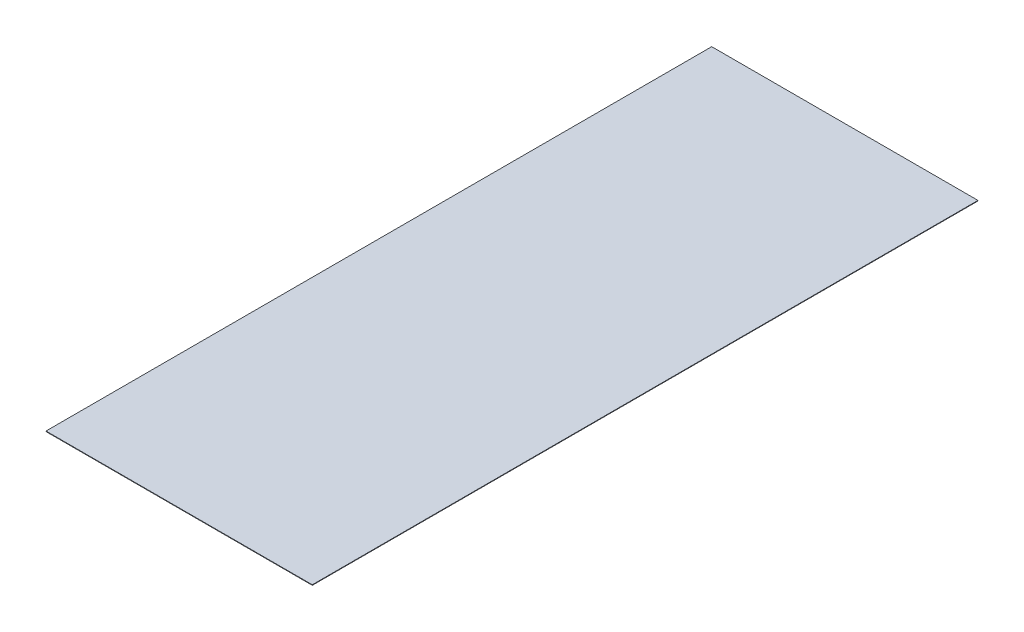
ISO-10303-21;
HEADER;
FILE_DESCRIPTION(('STEP AP214'),'2;1');
FILE_NAME('part.step','',(''),(''),'','','');
FILE_SCHEMA(('AUTOMOTIVE_DESIGN { 1 0 10303 214 1 1 1 1 }'));
ENDSEC;
DATA;
#1=APPLICATION_CONTEXT('core data for automotive mechanical design processes');
#2=APPLICATION_PROTOCOL_DEFINITION('international standard','automotive_design',2000,#1);
#3=PRODUCT_CONTEXT('',#1,'mechanical');
#4=PRODUCT('Part','Part','',(#3));
#5=PRODUCT_RELATED_PRODUCT_CATEGORY('part','',(#4));
#6=PRODUCT_DEFINITION_FORMATION('','',#4);
#7=PRODUCT_DEFINITION_CONTEXT('part definition',#1,'design');
#8=PRODUCT_DEFINITION('design','',#6,#7);
#9=PRODUCT_DEFINITION_SHAPE('','',#8);
#10=(LENGTH_UNIT() NAMED_UNIT(*) SI_UNIT(.MILLI.,.METRE.));
#11=(NAMED_UNIT(*) PLANE_ANGLE_UNIT() SI_UNIT($,.RADIAN.));
#12=(NAMED_UNIT(*) SI_UNIT($,.STERADIAN.) SOLID_ANGLE_UNIT());
#13=UNCERTAINTY_MEASURE_WITH_UNIT(LENGTH_MEASURE(1.E-05),#10,'distance_accuracy_value','');
#14=(GEOMETRIC_REPRESENTATION_CONTEXT(3) GLOBAL_UNCERTAINTY_ASSIGNED_CONTEXT((#13)) GLOBAL_UNIT_ASSIGNED_CONTEXT((#10,
#11,#12)) REPRESENTATION_CONTEXT('',''));
#15=CARTESIAN_POINT('',(0.,0.,0.));
#16=DIRECTION('',(0.,0.,1.));
#17=DIRECTION('',(1.,0.,0.));
#18=AXIS2_PLACEMENT_3D('',#15,#16,#17);
#19=CARTESIAN_POINT('',(609.6,2.3,1524.));
#20=DIRECTION('',(-1.,0.,0.));
#21=DIRECTION('',(0.,0.,1.));
#22=AXIS2_PLACEMENT_3D('',#19,#20,#21);
#23=PLANE('',#22);
#24=DIRECTION('',(0.,0.,-1.));
#25=VECTOR('',#24,1.);
#26=CARTESIAN_POINT('',(609.6,0.,1524.));
#27=LINE('',#26,#25);
#28=CARTESIAN_POINT('',(609.6,0.,1524.));
#29=VERTEX_POINT('',#28);
#30=CARTESIAN_POINT('',(609.6,0.,-1524.));
#31=VERTEX_POINT('',#30);
#32=EDGE_CURVE('E96',#29,#31,#27,.T.);
#33=ORIENTED_EDGE('',*,*,#32,.T.);
#34=DIRECTION('',(0.,-1.,0.));
#35=VECTOR('',#34,1.);
#36=CARTESIAN_POINT('',(609.6,2.3,-1524.));
#37=LINE('',#36,#35);
#38=CARTESIAN_POINT('',(609.6,2.3,-1524.));
#39=VERTEX_POINT('',#38);
#40=EDGE_CURVE('E11',#39,#31,#37,.T.);
#41=ORIENTED_EDGE('',*,*,#40,.F.);
#42=DIRECTION('',(0.,0.,-1.));
#43=VECTOR('',#42,1.);
#44=CARTESIAN_POINT('',(609.6,2.3,1524.));
#45=LINE('',#44,#43);
#46=CARTESIAN_POINT('',(609.6,2.3,1524.));
#47=VERTEX_POINT('',#46);
#48=EDGE_CURVE('E84',#47,#39,#45,.T.);
#49=ORIENTED_EDGE('',*,*,#48,.F.);
#50=DIRECTION('',(0.,-1.,0.));
#51=VECTOR('',#50,1.);
#52=CARTESIAN_POINT('',(609.6,2.3,1524.));
#53=LINE('',#52,#51);
#54=EDGE_CURVE('E92',#47,#29,#53,.T.);
#55=ORIENTED_EDGE('',*,*,#54,.T.);
#56=EDGE_LOOP('',(#33,#41,#49,#55));
#57=FACE_BOUND('',#56,.T.);
#58=ADVANCED_FACE('F33',(#57),#23,.F.);
#59=CARTESIAN_POINT('',(-609.6,2.3,-1524.));
#60=DIRECTION('',(0.,0.,1.));
#61=DIRECTION('',(1.,0.,0.));
#62=AXIS2_PLACEMENT_3D('',#59,#60,#61);
#63=PLANE('',#62);
#64=DIRECTION('',(-1.,0.,0.));
#65=VECTOR('',#64,1.);
#66=CARTESIAN_POINT('',(-609.6,0.,-1524.));
#67=LINE('',#66,#65);
#68=CARTESIAN_POINT('',(-609.6,0.,-1524.));
#69=VERTEX_POINT('',#68);
#70=EDGE_CURVE('E88',#31,#69,#67,.T.);
#71=ORIENTED_EDGE('',*,*,#70,.T.);
#72=DIRECTION('',(0.,-1.,0.));
#73=VECTOR('',#72,1.);
#74=CARTESIAN_POINT('',(-609.6,2.3,-1524.));
#75=LINE('',#74,#73);
#76=CARTESIAN_POINT('',(-609.6,2.3,-1524.));
#77=VERTEX_POINT('',#76);
#78=EDGE_CURVE('E41',#77,#69,#75,.T.);
#79=ORIENTED_EDGE('',*,*,#78,.F.);
#80=DIRECTION('',(-1.,0.,0.));
#81=VECTOR('',#80,1.);
#82=CARTESIAN_POINT('',(-609.6,2.3,-1524.));
#83=LINE('',#82,#81);
#84=EDGE_CURVE('E79',#39,#77,#83,.T.);
#85=ORIENTED_EDGE('',*,*,#84,.F.);
#86=ORIENTED_EDGE('',*,*,#40,.T.);
#87=EDGE_LOOP('',(#71,#79,#85,#86));
#88=FACE_BOUND('',#87,.T.);
#89=ADVANCED_FACE('F87',(#88),#63,.F.);
#90=CARTESIAN_POINT('',(-609.6,2.3,1524.));
#91=DIRECTION('',(1.,0.,0.));
#92=DIRECTION('',(0.,0.,-1.));
#93=AXIS2_PLACEMENT_3D('',#90,#91,#92);
#94=PLANE('',#93);
#95=DIRECTION('',(0.,0.,1.));
#96=VECTOR('',#95,1.);
#97=CARTESIAN_POINT('',(-609.6,0.,1524.));
#98=LINE('',#97,#96);
#99=CARTESIAN_POINT('',(-609.6,0.,1524.));
#100=VERTEX_POINT('',#99);
#101=EDGE_CURVE('E66',#69,#100,#98,.T.);
#102=ORIENTED_EDGE('',*,*,#101,.T.);
#103=DIRECTION('',(0.,-1.,0.));
#104=VECTOR('',#103,1.);
#105=CARTESIAN_POINT('',(-609.6,2.3,1524.));
#106=LINE('',#105,#104);
#107=CARTESIAN_POINT('',(-609.6,2.3,1524.));
#108=VERTEX_POINT('',#107);
#109=EDGE_CURVE('E89',#108,#100,#106,.T.);
#110=ORIENTED_EDGE('',*,*,#109,.F.);
#111=DIRECTION('',(0.,0.,1.));
#112=VECTOR('',#111,1.);
#113=CARTESIAN_POINT('',(-609.6,2.3,1524.));
#114=LINE('',#113,#112);
#115=EDGE_CURVE('E82',#77,#108,#114,.T.);
#116=ORIENTED_EDGE('',*,*,#115,.F.);
#117=ORIENTED_EDGE('',*,*,#78,.T.);
#118=EDGE_LOOP('',(#102,#110,#116,#117));
#119=FACE_BOUND('',#118,.T.);
#120=ADVANCED_FACE('F90',(#119),#94,.F.);
#121=CARTESIAN_POINT('',(-609.6,2.3,1524.));
#122=DIRECTION('',(0.,0.,-1.));
#123=DIRECTION('',(-1.,0.,0.));
#124=AXIS2_PLACEMENT_3D('',#121,#122,#123);
#125=PLANE('',#124);
#126=DIRECTION('',(1.,0.,0.));
#127=VECTOR('',#126,1.);
#128=CARTESIAN_POINT('',(-609.6,0.,1524.));
#129=LINE('',#128,#127);
#130=EDGE_CURVE('E72',#100,#29,#129,.T.);
#131=ORIENTED_EDGE('',*,*,#130,.T.);
#132=ORIENTED_EDGE('',*,*,#54,.F.);
#133=DIRECTION('',(1.,0.,0.));
#134=VECTOR('',#133,1.);
#135=CARTESIAN_POINT('',(-609.6,2.3,1524.));
#136=LINE('',#135,#134);
#137=EDGE_CURVE('E49',#108,#47,#136,.T.);
#138=ORIENTED_EDGE('',*,*,#137,.F.);
#139=ORIENTED_EDGE('',*,*,#109,.T.);
#140=EDGE_LOOP('',(#131,#132,#138,#139));
#141=FACE_BOUND('',#140,.T.);
#142=ADVANCED_FACE('F103',(#141),#125,.F.);
#143=CARTESIAN_POINT('',(0.,2.3,0.));
#144=DIRECTION('',(0.,-1.,0.));
#145=DIRECTION('',(0.,0.,-1.));
#146=AXIS2_PLACEMENT_3D('',#143,#144,#145);
#147=PLANE('',#146);
#148=ORIENTED_EDGE('',*,*,#48,.T.);
#149=ORIENTED_EDGE('',*,*,#84,.T.);
#150=ORIENTED_EDGE('',*,*,#115,.T.);
#151=ORIENTED_EDGE('',*,*,#137,.T.);
#152=EDGE_LOOP('',(#148,#149,#150,#151));
#153=FACE_BOUND('',#152,.T.);
#154=ADVANCED_FACE('F80',(#153),#147,.F.);
#155=CARTESIAN_POINT('',(0.,0.,0.));
#156=DIRECTION('',(0.,-1.,0.));
#157=DIRECTION('',(0.,0.,-1.));
#158=AXIS2_PLACEMENT_3D('',#155,#156,#157);
#159=PLANE('',#158);
#160=ORIENTED_EDGE('',*,*,#32,.F.);
#161=ORIENTED_EDGE('',*,*,#130,.F.);
#162=ORIENTED_EDGE('',*,*,#101,.F.);
#163=ORIENTED_EDGE('',*,*,#70,.F.);
#164=EDGE_LOOP('',(#160,#161,#162,#163));
#165=FACE_BOUND('',#164,.T.);
#166=ADVANCED_FACE('F106',(#165),#159,.T.);
#167=CLOSED_SHELL('',(#58,#89,#120,#142,#154,#166));
#168=MANIFOLD_SOLID_BREP('B2',#167);
#169=ADVANCED_BREP_SHAPE_REPRESENTATION('',(#18,#168),#14);
#170=SHAPE_DEFINITION_REPRESENTATION(#9,#169);
ENDSEC;
END-ISO-10303-21;
